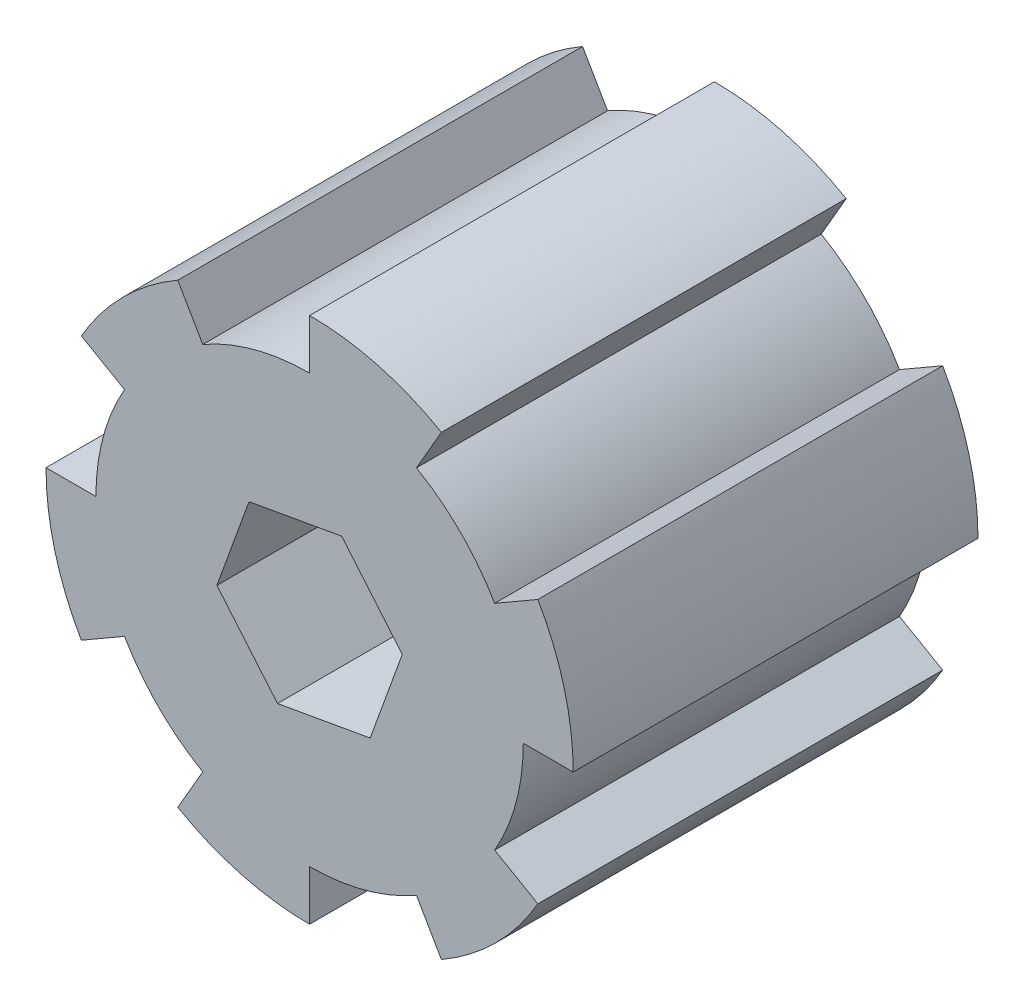
ISO-10303-21;
HEADER;
FILE_DESCRIPTION(('STEP AP214'),'2;1');
FILE_NAME('part.step','',(''),(''),'','','');
FILE_SCHEMA(('AUTOMOTIVE_DESIGN { 1 0 10303 214 1 1 1 1 }'));
ENDSEC;
DATA;
#1=APPLICATION_CONTEXT('core data for automotive mechanical design processes');
#2=APPLICATION_PROTOCOL_DEFINITION('international standard','automotive_design',2000,#1);
#3=PRODUCT_CONTEXT('',#1,'mechanical');
#4=PRODUCT('Part','Part','',(#3));
#5=PRODUCT_RELATED_PRODUCT_CATEGORY('part','',(#4));
#6=PRODUCT_DEFINITION_FORMATION('','',#4);
#7=PRODUCT_DEFINITION_CONTEXT('part definition',#1,'design');
#8=PRODUCT_DEFINITION('design','',#6,#7);
#9=PRODUCT_DEFINITION_SHAPE('','',#8);
#10=(LENGTH_UNIT() NAMED_UNIT(*) SI_UNIT(.MILLI.,.METRE.));
#11=(NAMED_UNIT(*) PLANE_ANGLE_UNIT() SI_UNIT($,.RADIAN.));
#12=(NAMED_UNIT(*) SI_UNIT($,.STERADIAN.) SOLID_ANGLE_UNIT());
#13=UNCERTAINTY_MEASURE_WITH_UNIT(LENGTH_MEASURE(1.E-05),#10,'distance_accuracy_value','');
#14=(GEOMETRIC_REPRESENTATION_CONTEXT(3) GLOBAL_UNCERTAINTY_ASSIGNED_CONTEXT((#13)) GLOBAL_UNIT_ASSIGNED_CONTEXT((#10,
#11,#12)) REPRESENTATION_CONTEXT('',''));
#15=CARTESIAN_POINT('',(0.,0.,0.));
#16=DIRECTION('',(0.,0.,1.));
#17=DIRECTION('',(1.,0.,0.));
#18=AXIS2_PLACEMENT_3D('',#15,#16,#17);
#19=CARTESIAN_POINT('',(0.,0.,21.5));
#20=DIRECTION('',(0.,0.,1.));
#21=DIRECTION('',(1.,0.,0.));
#22=AXIS2_PLACEMENT_3D('',#19,#20,#21);
#23=PLANE('',#22);
#24=CARTESIAN_POINT('',(0.,0.,21.5));
#25=DIRECTION('',(0.,0.,1.));
#26=DIRECTION('',(1.,0.,0.));
#27=AXIS2_PLACEMENT_3D('',#24,#25,#26);
#28=CIRCLE('',#27,11.35);
#29=CARTESIAN_POINT('',(0.,11.35,21.5));
#30=VERTEX_POINT('',#29);
#31=CARTESIAN_POINT('',(-5.67499999999995,9.82938833295341,21.5));
#32=VERTEX_POINT('',#31);
#33=EDGE_CURVE('E281',#30,#32,#28,.T.);
#34=ORIENTED_EDGE('',*,*,#33,.T.);
#35=DIRECTION('',(-0.499999999999995,0.866025403784441,0.));
#36=VECTOR('',#35,1.);
#37=CARTESIAN_POINT('',(-6.99999999999993,12.1243556529822,21.5));
#38=LINE('',#37,#36);
#39=CARTESIAN_POINT('',(-6.99999999999993,12.1243556529822,21.5));
#40=VERTEX_POINT('',#39);
#41=EDGE_CURVE('E284',#32,#40,#38,.T.);
#42=ORIENTED_EDGE('',*,*,#41,.T.);
#43=CARTESIAN_POINT('',(0.,0.,21.5));
#44=DIRECTION('',(0.,0.,1.));
#45=DIRECTION('',(1.,0.,0.));
#46=AXIS2_PLACEMENT_3D('',#43,#44,#45);
#47=CIRCLE('',#46,14.);
#48=CARTESIAN_POINT('',(-12.1243556529821,7.00000000000014,21.5));
#49=VERTEX_POINT('',#48);
#50=EDGE_CURVE('E287',#40,#49,#47,.T.);
#51=ORIENTED_EDGE('',*,*,#50,.T.);
#52=DIRECTION('',(0.866025403784433,-0.500000000000009,0.));
#53=VECTOR('',#52,1.);
#54=CARTESIAN_POINT('',(-9.82938833295331,5.67500000000011,21.5));
#55=LINE('',#54,#53);
#56=CARTESIAN_POINT('',(-9.82938833295331,5.67500000000011,21.5));
#57=VERTEX_POINT('',#56);
#58=EDGE_CURVE('E289',#49,#57,#55,.T.);
#59=ORIENTED_EDGE('',*,*,#58,.T.);
#60=CARTESIAN_POINT('',(0.,0.,21.5));
#61=DIRECTION('',(0.,0.,1.));
#62=DIRECTION('',(1.,0.,0.));
#63=AXIS2_PLACEMENT_3D('',#60,#61,#62);
#64=CIRCLE('',#63,11.35);
#65=CARTESIAN_POINT('',(-11.35,0.,21.5));
#66=VERTEX_POINT('',#65);
#67=EDGE_CURVE('E291',#57,#66,#64,.T.);
#68=ORIENTED_EDGE('',*,*,#67,.T.);
#69=DIRECTION('',(-1.,0.,0.));
#70=VECTOR('',#69,1.);
#71=CARTESIAN_POINT('',(-11.35,0.,21.5));
#72=LINE('',#71,#70);
#73=CARTESIAN_POINT('',(-14.,0.,21.5));
#74=VERTEX_POINT('',#73);
#75=EDGE_CURVE('E293',#66,#74,#72,.T.);
#76=ORIENTED_EDGE('',*,*,#75,.T.);
#77=CARTESIAN_POINT('',(0.,0.,21.5));
#78=DIRECTION('',(0.,0.,1.));
#79=DIRECTION('',(1.,0.,0.));
#80=AXIS2_PLACEMENT_3D('',#77,#78,#79);
#81=CIRCLE('',#80,14.);
#82=CARTESIAN_POINT('',(-12.1243556529821,-7.00000000000015,21.5));
#83=VERTEX_POINT('',#82);
#84=EDGE_CURVE('E295',#74,#83,#81,.T.);
#85=ORIENTED_EDGE('',*,*,#84,.T.);
#86=DIRECTION('',(0.866025403784432,0.500000000000011,0.));
#87=VECTOR('',#86,1.);
#88=CARTESIAN_POINT('',(-9.82938833295331,-5.67500000000012,21.5));
#89=LINE('',#88,#87);
#90=CARTESIAN_POINT('',(-9.82938833295331,-5.67500000000012,21.5));
#91=VERTEX_POINT('',#90);
#92=EDGE_CURVE('E297',#83,#91,#89,.T.);
#93=ORIENTED_EDGE('',*,*,#92,.T.);
#94=CARTESIAN_POINT('',(0.,0.,21.5));
#95=DIRECTION('',(0.,0.,1.));
#96=DIRECTION('',(1.,0.,0.));
#97=AXIS2_PLACEMENT_3D('',#94,#95,#96);
#98=CIRCLE('',#97,11.35);
#99=CARTESIAN_POINT('',(-5.67499999999994,-9.82938833295341,21.5));
#100=VERTEX_POINT('',#99);
#101=EDGE_CURVE('E299',#91,#100,#98,.T.);
#102=ORIENTED_EDGE('',*,*,#101,.T.);
#103=DIRECTION('',(-0.499999999999994,-0.866025403784442,0.));
#104=VECTOR('',#103,1.);
#105=CARTESIAN_POINT('',(-6.99999999999992,-12.1243556529822,21.5));
#106=LINE('',#105,#104);
#107=CARTESIAN_POINT('',(-6.99999999999992,-12.1243556529822,21.5));
#108=VERTEX_POINT('',#107);
#109=EDGE_CURVE('E301',#100,#108,#106,.T.);
#110=ORIENTED_EDGE('',*,*,#109,.T.);
#111=CARTESIAN_POINT('',(0.,0.,21.5));
#112=DIRECTION('',(0.,0.,1.));
#113=DIRECTION('',(1.,0.,0.));
#114=AXIS2_PLACEMENT_3D('',#111,#112,#113);
#115=CIRCLE('',#114,14.);
#116=CARTESIAN_POINT('',(0.,-14.,21.5));
#117=VERTEX_POINT('',#116);
#118=EDGE_CURVE('E303',#108,#117,#115,.T.);
#119=ORIENTED_EDGE('',*,*,#118,.T.);
#120=DIRECTION('',(0.,1.,0.));
#121=VECTOR('',#120,1.);
#122=CARTESIAN_POINT('',(0.,-11.35,21.5));
#123=LINE('',#122,#121);
#124=CARTESIAN_POINT('',(0.,-11.35,21.5));
#125=VERTEX_POINT('',#124);
#126=EDGE_CURVE('E305',#117,#125,#123,.T.);
#127=ORIENTED_EDGE('',*,*,#126,.T.);
#128=CARTESIAN_POINT('',(0.,0.,21.5));
#129=DIRECTION('',(0.,0.,1.));
#130=DIRECTION('',(1.,0.,0.));
#131=AXIS2_PLACEMENT_3D('',#128,#129,#130);
#132=CIRCLE('',#131,11.35);
#133=CARTESIAN_POINT('',(5.67499999999994,-9.82938833295341,21.5));
#134=VERTEX_POINT('',#133);
#135=EDGE_CURVE('E307',#125,#134,#132,.T.);
#136=ORIENTED_EDGE('',*,*,#135,.T.);
#137=DIRECTION('',(0.499999999999996,-0.866025403784441,0.));
#138=VECTOR('',#137,1.);
#139=CARTESIAN_POINT('',(5.67499999999994,-9.82938833295341,21.5));
#140=LINE('',#139,#138);
#141=CARTESIAN_POINT('',(6.99999999999993,-12.1243556529822,21.5));
#142=VERTEX_POINT('',#141);
#143=EDGE_CURVE('E309',#134,#142,#140,.T.);
#144=ORIENTED_EDGE('',*,*,#143,.T.);
#145=CARTESIAN_POINT('',(0.,0.,21.5));
#146=DIRECTION('',(0.,0.,1.));
#147=DIRECTION('',(1.,0.,0.));
#148=AXIS2_PLACEMENT_3D('',#145,#146,#147);
#149=CIRCLE('',#148,14.);
#150=CARTESIAN_POINT('',(12.1243556529821,-7.00000000000015,21.5));
#151=VERTEX_POINT('',#150);
#152=EDGE_CURVE('E311',#142,#151,#149,.T.);
#153=ORIENTED_EDGE('',*,*,#152,.T.);
#154=DIRECTION('',(-0.866025403784433,0.500000000000009,0.));
#155=VECTOR('',#154,1.);
#156=CARTESIAN_POINT('',(12.1243556529821,-7.00000000000014,21.5));
#157=LINE('',#156,#155);
#158=CARTESIAN_POINT('',(9.82938833295331,-5.67500000000011,21.5));
#159=VERTEX_POINT('',#158);
#160=EDGE_CURVE('E313',#151,#159,#157,.T.);
#161=ORIENTED_EDGE('',*,*,#160,.T.);
#162=CARTESIAN_POINT('',(0.,0.,21.5));
#163=DIRECTION('',(0.,0.,1.));
#164=DIRECTION('',(1.,0.,0.));
#165=AXIS2_PLACEMENT_3D('',#162,#163,#164);
#166=CIRCLE('',#165,11.35);
#167=CARTESIAN_POINT('',(11.35,0.,21.5));
#168=VERTEX_POINT('',#167);
#169=EDGE_CURVE('E315',#159,#168,#166,.T.);
#170=ORIENTED_EDGE('',*,*,#169,.T.);
#171=DIRECTION('',(1.,0.,0.));
#172=VECTOR('',#171,1.);
#173=CARTESIAN_POINT('',(14.,0.,21.5));
#174=LINE('',#173,#172);
#175=CARTESIAN_POINT('',(14.,0.,21.5));
#176=VERTEX_POINT('',#175);
#177=EDGE_CURVE('E317',#168,#176,#174,.T.);
#178=ORIENTED_EDGE('',*,*,#177,.T.);
#179=CARTESIAN_POINT('',(0.,0.,21.5));
#180=DIRECTION('',(0.,0.,1.));
#181=DIRECTION('',(1.,0.,0.));
#182=AXIS2_PLACEMENT_3D('',#179,#180,#181);
#183=CIRCLE('',#182,14.);
#184=CARTESIAN_POINT('',(12.1243556529821,7.00000000000014,21.5));
#185=VERTEX_POINT('',#184);
#186=EDGE_CURVE('E319',#176,#185,#183,.T.);
#187=ORIENTED_EDGE('',*,*,#186,.T.);
#188=DIRECTION('',(-0.866025403784432,-0.500000000000011,0.));
#189=VECTOR('',#188,1.);
#190=CARTESIAN_POINT('',(12.1243556529821,7.00000000000015,21.5));
#191=LINE('',#190,#189);
#192=CARTESIAN_POINT('',(9.82938833295331,5.67500000000012,21.5));
#193=VERTEX_POINT('',#192);
#194=EDGE_CURVE('E321',#185,#193,#191,.T.);
#195=ORIENTED_EDGE('',*,*,#194,.T.);
#196=CARTESIAN_POINT('',(0.,0.,21.5));
#197=DIRECTION('',(0.,0.,1.));
#198=DIRECTION('',(1.,0.,0.));
#199=AXIS2_PLACEMENT_3D('',#196,#197,#198);
#200=CIRCLE('',#199,11.35);
#201=CARTESIAN_POINT('',(5.67499999999994,9.82938833295341,21.5));
#202=VERTEX_POINT('',#201);
#203=EDGE_CURVE('E323',#193,#202,#200,.T.);
#204=ORIENTED_EDGE('',*,*,#203,.T.);
#205=DIRECTION('',(0.499999999999994,0.866025403784442,0.));
#206=VECTOR('',#205,1.);
#207=CARTESIAN_POINT('',(5.67499999999994,9.82938833295341,21.5));
#208=LINE('',#207,#206);
#209=CARTESIAN_POINT('',(6.99999999999992,12.1243556529822,21.5));
#210=VERTEX_POINT('',#209);
#211=EDGE_CURVE('E325',#202,#210,#208,.T.);
#212=ORIENTED_EDGE('',*,*,#211,.T.);
#213=CARTESIAN_POINT('',(0.,0.,21.5));
#214=DIRECTION('',(0.,0.,1.));
#215=DIRECTION('',(1.,0.,0.));
#216=AXIS2_PLACEMENT_3D('',#213,#214,#215);
#217=CIRCLE('',#216,14.);
#218=CARTESIAN_POINT('',(0.,14.,21.5));
#219=VERTEX_POINT('',#218);
#220=EDGE_CURVE('E327',#210,#219,#217,.T.);
#221=ORIENTED_EDGE('',*,*,#220,.T.);
#222=DIRECTION('',(0.,-1.,0.));
#223=VECTOR('',#222,1.);
#224=CARTESIAN_POINT('',(0.,14.,21.5));
#225=LINE('',#224,#223);
#226=EDGE_CURVE('E329',#219,#30,#225,.T.);
#227=ORIENTED_EDGE('',*,*,#226,.T.);
#228=EDGE_LOOP('',(#34,#42,#51,#59,#68,#76,#85,#93,#102,#110,#119,#127,#136,#144,#153,#161,#170,
#178,#187,#195,#204,#212,#221,#227));
#229=FACE_BOUND('',#228,.T.);
#230=DIRECTION('',(-0.643704535613658,0.765274114831022,0.));
#231=VECTOR('',#230,1.);
#232=CARTESIAN_POINT('',(4.92299546054572,0.874137114785912,21.5));
#233=LINE('',#232,#231);
#234=CARTESIAN_POINT('',(4.92299546054572,0.874137114785912,21.5));
#235=VERTEX_POINT('',#234);
#236=CARTESIAN_POINT('',(1.70447278247743,4.70050768894102,21.5));
#237=VERTEX_POINT('',#236);
#238=EDGE_CURVE('E238',#235,#237,#233,.T.);
#239=ORIENTED_EDGE('',*,*,#238,.F.);
#240=DIRECTION('',(0.340894556495485,0.940101537788204,0.));
#241=VECTOR('',#240,1.);
#242=CARTESIAN_POINT('',(3.21852267806829,-3.82637057415511,21.5));
#243=LINE('',#242,#241);
#244=CARTESIAN_POINT('',(3.21852267806829,-3.82637057415511,21.5));
#245=VERTEX_POINT('',#244);
#246=EDGE_CURVE('E230',#245,#235,#243,.T.);
#247=ORIENTED_EDGE('',*,*,#246,.F.);
#248=DIRECTION('',(0.984599092109144,0.174827422957182,0.));
#249=VECTOR('',#248,1.);
#250=CARTESIAN_POINT('',(-1.70447278247743,-4.70050768894102,21.5));
#251=LINE('',#250,#249);
#252=CARTESIAN_POINT('',(-1.70447278247743,-4.70050768894102,21.5));
#253=VERTEX_POINT('',#252);
#254=EDGE_CURVE('E259',#253,#245,#251,.T.);
#255=ORIENTED_EDGE('',*,*,#254,.F.);
#256=DIRECTION('',(0.643704535613658,-0.765274114831022,0.));
#257=VECTOR('',#256,1.);
#258=CARTESIAN_POINT('',(-4.92299546054572,-0.874137114785912,21.5));
#259=LINE('',#258,#257);
#260=CARTESIAN_POINT('',(-4.92299546054572,-0.874137114785912,21.5));
#261=VERTEX_POINT('',#260);
#262=EDGE_CURVE('E257',#261,#253,#259,.T.);
#263=ORIENTED_EDGE('',*,*,#262,.F.);
#264=DIRECTION('',(-0.340894556495485,-0.940101537788204,0.));
#265=VECTOR('',#264,1.);
#266=CARTESIAN_POINT('',(-3.21852267806829,3.82637057415511,21.5));
#267=LINE('',#266,#265);
#268=CARTESIAN_POINT('',(-3.21852267806829,3.82637057415511,21.5));
#269=VERTEX_POINT('',#268);
#270=EDGE_CURVE('E253',#269,#261,#267,.T.);
#271=ORIENTED_EDGE('',*,*,#270,.F.);
#272=DIRECTION('',(-0.984599092109144,-0.174827422957182,0.));
#273=VECTOR('',#272,1.);
#274=CARTESIAN_POINT('',(1.70447278247743,4.70050768894102,21.5));
#275=LINE('',#274,#273);
#276=EDGE_CURVE('E251',#237,#269,#275,.T.);
#277=ORIENTED_EDGE('',*,*,#276,.F.);
#278=EDGE_LOOP('',(#239,#247,#255,#263,#271,#277));
#279=FACE_BOUND('',#278,.T.);
#280=ADVANCED_FACE('F33',(#229,#279),#23,.T.);
#281=CARTESIAN_POINT('',(0.,0.,0.));
#282=DIRECTION('',(0.,0.,1.));
#283=DIRECTION('',(1.,0.,0.));
#284=AXIS2_PLACEMENT_3D('',#281,#282,#283);
#285=PLANE('',#284);
#286=CARTESIAN_POINT('',(0.,0.,0.));
#287=DIRECTION('',(0.,0.,1.));
#288=DIRECTION('',(1.,0.,0.));
#289=AXIS2_PLACEMENT_3D('',#286,#287,#288);
#290=CIRCLE('',#289,11.35);
#291=CARTESIAN_POINT('',(0.,11.35,0.));
#292=VERTEX_POINT('',#291);
#293=CARTESIAN_POINT('',(-5.67499999999995,9.82938833295341,0.));
#294=VERTEX_POINT('',#293);
#295=EDGE_CURVE('E246',#292,#294,#290,.T.);
#296=ORIENTED_EDGE('',*,*,#295,.F.);
#297=DIRECTION('',(0.,-1.,0.));
#298=VECTOR('',#297,1.);
#299=CARTESIAN_POINT('',(0.,14.,0.));
#300=LINE('',#299,#298);
#301=CARTESIAN_POINT('',(0.,14.,0.));
#302=VERTEX_POINT('',#301);
#303=EDGE_CURVE('E285',#302,#292,#300,.T.);
#304=ORIENTED_EDGE('',*,*,#303,.F.);
#305=CARTESIAN_POINT('',(0.,0.,0.));
#306=DIRECTION('',(0.,0.,1.));
#307=DIRECTION('',(1.,0.,0.));
#308=AXIS2_PLACEMENT_3D('',#305,#306,#307);
#309=CIRCLE('',#308,14.);
#310=CARTESIAN_POINT('',(6.99999999999992,12.1243556529822,0.));
#311=VERTEX_POINT('',#310);
#312=EDGE_CURVE('E376',#311,#302,#309,.T.);
#313=ORIENTED_EDGE('',*,*,#312,.F.);
#314=DIRECTION('',(0.499999999999994,0.866025403784442,0.));
#315=VECTOR('',#314,1.);
#316=CARTESIAN_POINT('',(5.67499999999994,9.82938833295341,0.));
#317=LINE('',#316,#315);
#318=CARTESIAN_POINT('',(5.67499999999994,9.82938833295341,0.));
#319=VERTEX_POINT('',#318);
#320=EDGE_CURVE('E374',#319,#311,#317,.T.);
#321=ORIENTED_EDGE('',*,*,#320,.F.);
#322=CARTESIAN_POINT('',(0.,0.,0.));
#323=DIRECTION('',(0.,0.,1.));
#324=DIRECTION('',(1.,0.,0.));
#325=AXIS2_PLACEMENT_3D('',#322,#323,#324);
#326=CIRCLE('',#325,11.35);
#327=CARTESIAN_POINT('',(9.82938833295331,5.67500000000012,0.));
#328=VERTEX_POINT('',#327);
#329=EDGE_CURVE('E372',#328,#319,#326,.T.);
#330=ORIENTED_EDGE('',*,*,#329,.F.);
#331=DIRECTION('',(-0.866025403784432,-0.500000000000011,0.));
#332=VECTOR('',#331,1.);
#333=CARTESIAN_POINT('',(12.1243556529821,7.00000000000015,0.));
#334=LINE('',#333,#332);
#335=CARTESIAN_POINT('',(12.1243556529821,7.00000000000014,0.));
#336=VERTEX_POINT('',#335);
#337=EDGE_CURVE('E370',#336,#328,#334,.T.);
#338=ORIENTED_EDGE('',*,*,#337,.F.);
#339=CARTESIAN_POINT('',(0.,0.,0.));
#340=DIRECTION('',(0.,0.,1.));
#341=DIRECTION('',(1.,0.,0.));
#342=AXIS2_PLACEMENT_3D('',#339,#340,#341);
#343=CIRCLE('',#342,14.);
#344=CARTESIAN_POINT('',(14.,0.,0.));
#345=VERTEX_POINT('',#344);
#346=EDGE_CURVE('E368',#345,#336,#343,.T.);
#347=ORIENTED_EDGE('',*,*,#346,.F.);
#348=DIRECTION('',(1.,0.,0.));
#349=VECTOR('',#348,1.);
#350=CARTESIAN_POINT('',(14.,0.,0.));
#351=LINE('',#350,#349);
#352=CARTESIAN_POINT('',(11.35,0.,0.));
#353=VERTEX_POINT('',#352);
#354=EDGE_CURVE('E366',#353,#345,#351,.T.);
#355=ORIENTED_EDGE('',*,*,#354,.F.);
#356=CARTESIAN_POINT('',(0.,0.,0.));
#357=DIRECTION('',(0.,0.,1.));
#358=DIRECTION('',(1.,0.,0.));
#359=AXIS2_PLACEMENT_3D('',#356,#357,#358);
#360=CIRCLE('',#359,11.35);
#361=CARTESIAN_POINT('',(9.82938833295331,-5.67500000000011,0.));
#362=VERTEX_POINT('',#361);
#363=EDGE_CURVE('E364',#362,#353,#360,.T.);
#364=ORIENTED_EDGE('',*,*,#363,.F.);
#365=DIRECTION('',(-0.866025403784433,0.500000000000009,0.));
#366=VECTOR('',#365,1.);
#367=CARTESIAN_POINT('',(12.1243556529821,-7.00000000000014,0.));
#368=LINE('',#367,#366);
#369=CARTESIAN_POINT('',(12.1243556529821,-7.00000000000015,0.));
#370=VERTEX_POINT('',#369);
#371=EDGE_CURVE('E362',#370,#362,#368,.T.);
#372=ORIENTED_EDGE('',*,*,#371,.F.);
#373=CARTESIAN_POINT('',(0.,0.,0.));
#374=DIRECTION('',(0.,0.,1.));
#375=DIRECTION('',(1.,0.,0.));
#376=AXIS2_PLACEMENT_3D('',#373,#374,#375);
#377=CIRCLE('',#376,14.);
#378=CARTESIAN_POINT('',(6.99999999999993,-12.1243556529822,0.));
#379=VERTEX_POINT('',#378);
#380=EDGE_CURVE('E360',#379,#370,#377,.T.);
#381=ORIENTED_EDGE('',*,*,#380,.F.);
#382=DIRECTION('',(0.499999999999996,-0.866025403784441,0.));
#383=VECTOR('',#382,1.);
#384=CARTESIAN_POINT('',(5.67499999999994,-9.82938833295341,0.));
#385=LINE('',#384,#383);
#386=CARTESIAN_POINT('',(5.67499999999994,-9.82938833295341,0.));
#387=VERTEX_POINT('',#386);
#388=EDGE_CURVE('E358',#387,#379,#385,.T.);
#389=ORIENTED_EDGE('',*,*,#388,.F.);
#390=CARTESIAN_POINT('',(0.,0.,0.));
#391=DIRECTION('',(0.,0.,1.));
#392=DIRECTION('',(1.,0.,0.));
#393=AXIS2_PLACEMENT_3D('',#390,#391,#392);
#394=CIRCLE('',#393,11.35);
#395=CARTESIAN_POINT('',(0.,-11.35,0.));
#396=VERTEX_POINT('',#395);
#397=EDGE_CURVE('E356',#396,#387,#394,.T.);
#398=ORIENTED_EDGE('',*,*,#397,.F.);
#399=DIRECTION('',(0.,1.,0.));
#400=VECTOR('',#399,1.);
#401=CARTESIAN_POINT('',(0.,-11.35,0.));
#402=LINE('',#401,#400);
#403=CARTESIAN_POINT('',(0.,-14.,0.));
#404=VERTEX_POINT('',#403);
#405=EDGE_CURVE('E354',#404,#396,#402,.T.);
#406=ORIENTED_EDGE('',*,*,#405,.F.);
#407=CARTESIAN_POINT('',(0.,0.,0.));
#408=DIRECTION('',(0.,0.,1.));
#409=DIRECTION('',(1.,0.,0.));
#410=AXIS2_PLACEMENT_3D('',#407,#408,#409);
#411=CIRCLE('',#410,14.);
#412=CARTESIAN_POINT('',(-6.99999999999992,-12.1243556529822,0.));
#413=VERTEX_POINT('',#412);
#414=EDGE_CURVE('E352',#413,#404,#411,.T.);
#415=ORIENTED_EDGE('',*,*,#414,.F.);
#416=DIRECTION('',(-0.499999999999994,-0.866025403784442,0.));
#417=VECTOR('',#416,1.);
#418=CARTESIAN_POINT('',(-6.99999999999992,-12.1243556529822,0.));
#419=LINE('',#418,#417);
#420=CARTESIAN_POINT('',(-5.67499999999994,-9.82938833295341,0.));
#421=VERTEX_POINT('',#420);
#422=EDGE_CURVE('E350',#421,#413,#419,.T.);
#423=ORIENTED_EDGE('',*,*,#422,.F.);
#424=CARTESIAN_POINT('',(0.,0.,0.));
#425=DIRECTION('',(0.,0.,1.));
#426=DIRECTION('',(1.,0.,0.));
#427=AXIS2_PLACEMENT_3D('',#424,#425,#426);
#428=CIRCLE('',#427,11.35);
#429=CARTESIAN_POINT('',(-9.82938833295331,-5.67500000000012,0.));
#430=VERTEX_POINT('',#429);
#431=EDGE_CURVE('E348',#430,#421,#428,.T.);
#432=ORIENTED_EDGE('',*,*,#431,.F.);
#433=DIRECTION('',(0.866025403784432,0.500000000000011,0.));
#434=VECTOR('',#433,1.);
#435=CARTESIAN_POINT('',(-9.82938833295331,-5.67500000000012,0.));
#436=LINE('',#435,#434);
#437=CARTESIAN_POINT('',(-12.1243556529821,-7.00000000000015,0.));
#438=VERTEX_POINT('',#437);
#439=EDGE_CURVE('E346',#438,#430,#436,.T.);
#440=ORIENTED_EDGE('',*,*,#439,.F.);
#441=CARTESIAN_POINT('',(0.,0.,0.));
#442=DIRECTION('',(0.,0.,1.));
#443=DIRECTION('',(1.,0.,0.));
#444=AXIS2_PLACEMENT_3D('',#441,#442,#443);
#445=CIRCLE('',#444,14.);
#446=CARTESIAN_POINT('',(-14.,0.,0.));
#447=VERTEX_POINT('',#446);
#448=EDGE_CURVE('E344',#447,#438,#445,.T.);
#449=ORIENTED_EDGE('',*,*,#448,.F.);
#450=DIRECTION('',(-1.,0.,0.));
#451=VECTOR('',#450,1.);
#452=CARTESIAN_POINT('',(-11.35,0.,0.));
#453=LINE('',#452,#451);
#454=CARTESIAN_POINT('',(-11.35,0.,0.));
#455=VERTEX_POINT('',#454);
#456=EDGE_CURVE('E342',#455,#447,#453,.T.);
#457=ORIENTED_EDGE('',*,*,#456,.F.);
#458=CARTESIAN_POINT('',(0.,0.,0.));
#459=DIRECTION('',(0.,0.,1.));
#460=DIRECTION('',(1.,0.,0.));
#461=AXIS2_PLACEMENT_3D('',#458,#459,#460);
#462=CIRCLE('',#461,11.35);
#463=CARTESIAN_POINT('',(-9.82938833295331,5.67500000000011,0.));
#464=VERTEX_POINT('',#463);
#465=EDGE_CURVE('E340',#464,#455,#462,.T.);
#466=ORIENTED_EDGE('',*,*,#465,.F.);
#467=DIRECTION('',(0.866025403784433,-0.500000000000009,0.));
#468=VECTOR('',#467,1.);
#469=CARTESIAN_POINT('',(-9.82938833295331,5.67500000000011,0.));
#470=LINE('',#469,#468);
#471=CARTESIAN_POINT('',(-12.1243556529821,7.00000000000014,0.));
#472=VERTEX_POINT('',#471);
#473=EDGE_CURVE('E338',#472,#464,#470,.T.);
#474=ORIENTED_EDGE('',*,*,#473,.F.);
#475=CARTESIAN_POINT('',(0.,0.,0.));
#476=DIRECTION('',(0.,0.,1.));
#477=DIRECTION('',(1.,0.,0.));
#478=AXIS2_PLACEMENT_3D('',#475,#476,#477);
#479=CIRCLE('',#478,14.);
#480=CARTESIAN_POINT('',(-6.99999999999993,12.1243556529822,0.));
#481=VERTEX_POINT('',#480);
#482=EDGE_CURVE('E336',#481,#472,#479,.T.);
#483=ORIENTED_EDGE('',*,*,#482,.F.);
#484=DIRECTION('',(-0.499999999999995,0.866025403784441,0.));
#485=VECTOR('',#484,1.);
#486=CARTESIAN_POINT('',(-6.99999999999993,12.1243556529822,0.));
#487=LINE('',#486,#485);
#488=EDGE_CURVE('E334',#294,#481,#487,.T.);
#489=ORIENTED_EDGE('',*,*,#488,.F.);
#490=EDGE_LOOP('',(#296,#304,#313,#321,#330,#338,#347,#355,#364,#372,#381,#389,#398,#406,#415,
#423,#432,#440,#449,#457,#466,#474,#483,#489));
#491=FACE_BOUND('',#490,.T.);
#492=DIRECTION('',(0.340894556495485,0.940101537788204,0.));
#493=VECTOR('',#492,1.);
#494=CARTESIAN_POINT('',(3.21852267806829,-3.82637057415511,0.));
#495=LINE('',#494,#493);
#496=CARTESIAN_POINT('',(3.21852267806829,-3.82637057415511,0.));
#497=VERTEX_POINT('',#496);
#498=CARTESIAN_POINT('',(4.92299546054572,0.874137114785912,0.));
#499=VERTEX_POINT('',#498);
#500=EDGE_CURVE('E56',#497,#499,#495,.T.);
#501=ORIENTED_EDGE('',*,*,#500,.T.);
#502=DIRECTION('',(-0.643704535613658,0.765274114831022,0.));
#503=VECTOR('',#502,1.);
#504=CARTESIAN_POINT('',(4.92299546054572,0.874137114785912,0.));
#505=LINE('',#504,#503);
#506=CARTESIAN_POINT('',(1.70447278247743,4.70050768894102,0.));
#507=VERTEX_POINT('',#506);
#508=EDGE_CURVE('E245',#499,#507,#505,.T.);
#509=ORIENTED_EDGE('',*,*,#508,.T.);
#510=DIRECTION('',(-0.984599092109144,-0.174827422957182,0.));
#511=VECTOR('',#510,1.);
#512=CARTESIAN_POINT('',(1.70447278247743,4.70050768894102,0.));
#513=LINE('',#512,#511);
#514=CARTESIAN_POINT('',(-3.21852267806829,3.82637057415511,0.));
#515=VERTEX_POINT('',#514);
#516=EDGE_CURVE('E263',#507,#515,#513,.T.);
#517=ORIENTED_EDGE('',*,*,#516,.T.);
#518=DIRECTION('',(-0.340894556495485,-0.940101537788204,0.));
#519=VECTOR('',#518,1.);
#520=CARTESIAN_POINT('',(-3.21852267806829,3.82637057415511,0.));
#521=LINE('',#520,#519);
#522=CARTESIAN_POINT('',(-4.92299546054572,-0.874137114785912,0.));
#523=VERTEX_POINT('',#522);
#524=EDGE_CURVE('E266',#515,#523,#521,.T.);
#525=ORIENTED_EDGE('',*,*,#524,.T.);
#526=DIRECTION('',(0.643704535613658,-0.765274114831022,0.));
#527=VECTOR('',#526,1.);
#528=CARTESIAN_POINT('',(-4.92299546054572,-0.874137114785912,0.));
#529=LINE('',#528,#527);
#530=CARTESIAN_POINT('',(-1.70447278247743,-4.70050768894102,0.));
#531=VERTEX_POINT('',#530);
#532=EDGE_CURVE('E269',#523,#531,#529,.T.);
#533=ORIENTED_EDGE('',*,*,#532,.T.);
#534=DIRECTION('',(0.984599092109144,0.174827422957182,0.));
#535=VECTOR('',#534,1.);
#536=CARTESIAN_POINT('',(-1.70447278247743,-4.70050768894102,0.));
#537=LINE('',#536,#535);
#538=EDGE_CURVE('E239',#531,#497,#537,.T.);
#539=ORIENTED_EDGE('',*,*,#538,.T.);
#540=EDGE_LOOP('',(#501,#509,#517,#525,#533,#539));
#541=FACE_BOUND('',#540,.T.);
#542=ADVANCED_FACE('F454',(#491,#541),#285,.F.);
#543=CARTESIAN_POINT('',(0.,0.,21.5));
#544=DIRECTION('',(0.,0.,-1.));
#545=DIRECTION('',(-1.,0.,0.));
#546=AXIS2_PLACEMENT_3D('',#543,#544,#545);
#547=CYLINDRICAL_SURFACE('',#546,11.35);
#548=ORIENTED_EDGE('',*,*,#295,.T.);
#549=DIRECTION('',(0.,0.,-1.));
#550=VECTOR('',#549,1.);
#551=CARTESIAN_POINT('',(-5.67499999999995,9.82938833295341,21.5));
#552=LINE('',#551,#550);
#553=EDGE_CURVE('E11',#32,#294,#552,.T.);
#554=ORIENTED_EDGE('',*,*,#553,.F.);
#555=ORIENTED_EDGE('',*,*,#33,.F.);
#556=DIRECTION('',(0.,0.,-1.));
#557=VECTOR('',#556,1.);
#558=CARTESIAN_POINT('',(0.,11.35,21.5));
#559=LINE('',#558,#557);
#560=EDGE_CURVE('E331',#30,#292,#559,.T.);
#561=ORIENTED_EDGE('',*,*,#560,.T.);
#562=EDGE_LOOP('',(#548,#554,#555,#561));
#563=FACE_BOUND('',#562,.T.);
#564=ADVANCED_FACE('F35',(#563),#547,.T.);
#565=CARTESIAN_POINT('',(-6.99999999999993,12.1243556529822,21.5));
#566=DIRECTION('',(-0.866025403784441,-0.499999999999995,0.));
#567=DIRECTION('',(0.499999999999995,-0.866025403784441,0.));
#568=AXIS2_PLACEMENT_3D('',#565,#566,#567);
#569=PLANE('',#568);
#570=ORIENTED_EDGE('',*,*,#488,.T.);
#571=DIRECTION('',(0.,0.,-1.));
#572=VECTOR('',#571,1.);
#573=CARTESIAN_POINT('',(-6.99999999999993,12.1243556529822,21.5));
#574=LINE('',#573,#572);
#575=EDGE_CURVE('E41',#40,#481,#574,.T.);
#576=ORIENTED_EDGE('',*,*,#575,.F.);
#577=ORIENTED_EDGE('',*,*,#41,.F.);
#578=ORIENTED_EDGE('',*,*,#553,.T.);
#579=EDGE_LOOP('',(#570,#576,#577,#578));
#580=FACE_BOUND('',#579,.T.);
#581=ADVANCED_FACE('F471',(#580),#569,.F.);
#582=CARTESIAN_POINT('',(0.,0.,21.5));
#583=DIRECTION('',(0.,0.,-1.));
#584=DIRECTION('',(-1.,0.,0.));
#585=AXIS2_PLACEMENT_3D('',#582,#583,#584);
#586=CYLINDRICAL_SURFACE('',#585,14.);
#587=ORIENTED_EDGE('',*,*,#482,.T.);
#588=DIRECTION('',(0.,0.,-1.));
#589=VECTOR('',#588,1.);
#590=CARTESIAN_POINT('',(-12.1243556529821,7.00000000000014,21.5));
#591=LINE('',#590,#589);
#592=EDGE_CURVE('E441',#49,#472,#591,.T.);
#593=ORIENTED_EDGE('',*,*,#592,.F.);
#594=ORIENTED_EDGE('',*,*,#50,.F.);
#595=ORIENTED_EDGE('',*,*,#575,.T.);
#596=EDGE_LOOP('',(#587,#593,#594,#595));
#597=FACE_BOUND('',#596,.T.);
#598=ADVANCED_FACE('F448',(#597),#586,.T.);
#599=CARTESIAN_POINT('',(-9.82938833295331,5.67500000000011,21.5));
#600=DIRECTION('',(0.500000000000009,0.866025403784433,0.));
#601=DIRECTION('',(-0.866025403784433,0.500000000000009,0.));
#602=AXIS2_PLACEMENT_3D('',#599,#600,#601);
#603=PLANE('',#602);
#604=ORIENTED_EDGE('',*,*,#473,.T.);
#605=DIRECTION('',(0.,0.,-1.));
#606=VECTOR('',#605,1.);
#607=CARTESIAN_POINT('',(-9.82938833295331,5.67500000000011,21.5));
#608=LINE('',#607,#606);
#609=EDGE_CURVE('E438',#57,#464,#608,.T.);
#610=ORIENTED_EDGE('',*,*,#609,.F.);
#611=ORIENTED_EDGE('',*,*,#58,.F.);
#612=ORIENTED_EDGE('',*,*,#592,.T.);
#613=EDGE_LOOP('',(#604,#610,#611,#612));
#614=FACE_BOUND('',#613,.T.);
#615=ADVANCED_FACE('F460',(#614),#603,.F.);
#616=CARTESIAN_POINT('',(0.,0.,21.5));
#617=DIRECTION('',(0.,0.,-1.));
#618=DIRECTION('',(-1.,0.,0.));
#619=AXIS2_PLACEMENT_3D('',#616,#617,#618);
#620=CYLINDRICAL_SURFACE('',#619,11.35);
#621=ORIENTED_EDGE('',*,*,#465,.T.);
#622=DIRECTION('',(0.,0.,-1.));
#623=VECTOR('',#622,1.);
#624=CARTESIAN_POINT('',(-11.35,0.,21.5));
#625=LINE('',#624,#623);
#626=EDGE_CURVE('E435',#66,#455,#625,.T.);
#627=ORIENTED_EDGE('',*,*,#626,.F.);
#628=ORIENTED_EDGE('',*,*,#67,.F.);
#629=ORIENTED_EDGE('',*,*,#609,.T.);
#630=EDGE_LOOP('',(#621,#627,#628,#629));
#631=FACE_BOUND('',#630,.T.);
#632=ADVANCED_FACE('F464',(#631),#620,.T.);
#633=CARTESIAN_POINT('',(-11.35,0.,21.5));
#634=DIRECTION('',(0.,-1.,0.));
#635=DIRECTION('',(1.,0.,0.));
#636=AXIS2_PLACEMENT_3D('',#633,#634,#635);
#637=PLANE('',#636);
#638=ORIENTED_EDGE('',*,*,#456,.T.);
#639=DIRECTION('',(0.,0.,-1.));
#640=VECTOR('',#639,1.);
#641=CARTESIAN_POINT('',(-14.,0.,21.5));
#642=LINE('',#641,#640);
#643=EDGE_CURVE('E432',#74,#447,#642,.T.);
#644=ORIENTED_EDGE('',*,*,#643,.F.);
#645=ORIENTED_EDGE('',*,*,#75,.F.);
#646=ORIENTED_EDGE('',*,*,#626,.T.);
#647=EDGE_LOOP('',(#638,#644,#645,#646));
#648=FACE_BOUND('',#647,.T.);
#649=ADVANCED_FACE('F564',(#648),#637,.F.);
#650=CARTESIAN_POINT('',(0.,0.,21.5));
#651=DIRECTION('',(0.,0.,-1.));
#652=DIRECTION('',(-1.,0.,0.));
#653=AXIS2_PLACEMENT_3D('',#650,#651,#652);
#654=CYLINDRICAL_SURFACE('',#653,14.);
#655=ORIENTED_EDGE('',*,*,#448,.T.);
#656=DIRECTION('',(0.,0.,-1.));
#657=VECTOR('',#656,1.);
#658=CARTESIAN_POINT('',(-12.1243556529821,-7.00000000000015,21.5));
#659=LINE('',#658,#657);
#660=EDGE_CURVE('E429',#83,#438,#659,.T.);
#661=ORIENTED_EDGE('',*,*,#660,.F.);
#662=ORIENTED_EDGE('',*,*,#84,.F.);
#663=ORIENTED_EDGE('',*,*,#643,.T.);
#664=EDGE_LOOP('',(#655,#661,#662,#663));
#665=FACE_BOUND('',#664,.T.);
#666=ADVANCED_FACE('F562',(#665),#654,.T.);
#667=CARTESIAN_POINT('',(-9.82938833295331,-5.67500000000012,21.5));
#668=DIRECTION('',(-0.500000000000011,0.866025403784432,0.));
#669=DIRECTION('',(-0.866025403784432,-0.500000000000011,0.));
#670=AXIS2_PLACEMENT_3D('',#667,#668,#669);
#671=PLANE('',#670);
#672=ORIENTED_EDGE('',*,*,#439,.T.);
#673=DIRECTION('',(0.,0.,-1.));
#674=VECTOR('',#673,1.);
#675=CARTESIAN_POINT('',(-9.82938833295331,-5.67500000000012,21.5));
#676=LINE('',#675,#674);
#677=EDGE_CURVE('E426',#91,#430,#676,.T.);
#678=ORIENTED_EDGE('',*,*,#677,.F.);
#679=ORIENTED_EDGE('',*,*,#92,.F.);
#680=ORIENTED_EDGE('',*,*,#660,.T.);
#681=EDGE_LOOP('',(#672,#678,#679,#680));
#682=FACE_BOUND('',#681,.T.);
#683=ADVANCED_FACE('F558',(#682),#671,.F.);
#684=CARTESIAN_POINT('',(0.,0.,21.5));
#685=DIRECTION('',(0.,0.,-1.));
#686=DIRECTION('',(-1.,0.,0.));
#687=AXIS2_PLACEMENT_3D('',#684,#685,#686);
#688=CYLINDRICAL_SURFACE('',#687,11.35);
#689=ORIENTED_EDGE('',*,*,#431,.T.);
#690=DIRECTION('',(0.,0.,-1.));
#691=VECTOR('',#690,1.);
#692=CARTESIAN_POINT('',(-5.67499999999994,-9.82938833295341,21.5));
#693=LINE('',#692,#691);
#694=EDGE_CURVE('E423',#100,#421,#693,.T.);
#695=ORIENTED_EDGE('',*,*,#694,.F.);
#696=ORIENTED_EDGE('',*,*,#101,.F.);
#697=ORIENTED_EDGE('',*,*,#677,.T.);
#698=EDGE_LOOP('',(#689,#695,#696,#697));
#699=FACE_BOUND('',#698,.T.);
#700=ADVANCED_FACE('F553',(#699),#688,.T.);
#701=CARTESIAN_POINT('',(-6.99999999999992,-12.1243556529822,21.5));
#702=DIRECTION('',(0.866025403784442,-0.499999999999994,0.));
#703=DIRECTION('',(0.499999999999994,0.866025403784442,0.));
#704=AXIS2_PLACEMENT_3D('',#701,#702,#703);
#705=PLANE('',#704);
#706=ORIENTED_EDGE('',*,*,#422,.T.);
#707=DIRECTION('',(0.,0.,-1.));
#708=VECTOR('',#707,1.);
#709=CARTESIAN_POINT('',(-6.99999999999992,-12.1243556529822,21.5));
#710=LINE('',#709,#708);
#711=EDGE_CURVE('E420',#108,#413,#710,.T.);
#712=ORIENTED_EDGE('',*,*,#711,.F.);
#713=ORIENTED_EDGE('',*,*,#109,.F.);
#714=ORIENTED_EDGE('',*,*,#694,.T.);
#715=EDGE_LOOP('',(#706,#712,#713,#714));
#716=FACE_BOUND('',#715,.T.);
#717=ADVANCED_FACE('F547',(#716),#705,.F.);
#718=CARTESIAN_POINT('',(0.,0.,21.5));
#719=DIRECTION('',(0.,0.,-1.));
#720=DIRECTION('',(-1.,0.,0.));
#721=AXIS2_PLACEMENT_3D('',#718,#719,#720);
#722=CYLINDRICAL_SURFACE('',#721,14.);
#723=ORIENTED_EDGE('',*,*,#414,.T.);
#724=DIRECTION('',(0.,0.,-1.));
#725=VECTOR('',#724,1.);
#726=CARTESIAN_POINT('',(0.,-14.,21.5));
#727=LINE('',#726,#725);
#728=EDGE_CURVE('E417',#117,#404,#727,.T.);
#729=ORIENTED_EDGE('',*,*,#728,.F.);
#730=ORIENTED_EDGE('',*,*,#118,.F.);
#731=ORIENTED_EDGE('',*,*,#711,.T.);
#732=EDGE_LOOP('',(#723,#729,#730,#731));
#733=FACE_BOUND('',#732,.T.);
#734=ADVANCED_FACE('F543',(#733),#722,.T.);
#735=CARTESIAN_POINT('',(0.,-11.35,21.5));
#736=DIRECTION('',(-1.,0.,0.));
#737=DIRECTION('',(0.,-1.,0.));
#738=AXIS2_PLACEMENT_3D('',#735,#736,#737);
#739=PLANE('',#738);
#740=ORIENTED_EDGE('',*,*,#405,.T.);
#741=DIRECTION('',(0.,0.,-1.));
#742=VECTOR('',#741,1.);
#743=CARTESIAN_POINT('',(0.,-11.35,21.5));
#744=LINE('',#743,#742);
#745=EDGE_CURVE('E414',#125,#396,#744,.T.);
#746=ORIENTED_EDGE('',*,*,#745,.F.);
#747=ORIENTED_EDGE('',*,*,#126,.F.);
#748=ORIENTED_EDGE('',*,*,#728,.T.);
#749=EDGE_LOOP('',(#740,#746,#747,#748));
#750=FACE_BOUND('',#749,.T.);
#751=ADVANCED_FACE('F538',(#750),#739,.F.);
#752=CARTESIAN_POINT('',(0.,0.,21.5));
#753=DIRECTION('',(0.,0.,-1.));
#754=DIRECTION('',(-1.,0.,0.));
#755=AXIS2_PLACEMENT_3D('',#752,#753,#754);
#756=CYLINDRICAL_SURFACE('',#755,11.35);
#757=ORIENTED_EDGE('',*,*,#397,.T.);
#758=DIRECTION('',(0.,0.,-1.));
#759=VECTOR('',#758,1.);
#760=CARTESIAN_POINT('',(5.67499999999994,-9.82938833295341,21.5));
#761=LINE('',#760,#759);
#762=EDGE_CURVE('E411',#134,#387,#761,.T.);
#763=ORIENTED_EDGE('',*,*,#762,.F.);
#764=ORIENTED_EDGE('',*,*,#135,.F.);
#765=ORIENTED_EDGE('',*,*,#745,.T.);
#766=EDGE_LOOP('',(#757,#763,#764,#765));
#767=FACE_BOUND('',#766,.T.);
#768=ADVANCED_FACE('F532',(#767),#756,.T.);
#769=CARTESIAN_POINT('',(5.67499999999994,-9.82938833295341,21.5));
#770=DIRECTION('',(0.866025403784441,0.499999999999996,0.));
#771=DIRECTION('',(-0.499999999999996,0.866025403784441,0.));
#772=AXIS2_PLACEMENT_3D('',#769,#770,#771);
#773=PLANE('',#772);
#774=ORIENTED_EDGE('',*,*,#388,.T.);
#775=DIRECTION('',(0.,0.,-1.));
#776=VECTOR('',#775,1.);
#777=CARTESIAN_POINT('',(6.99999999999993,-12.1243556529822,21.5));
#778=LINE('',#777,#776);
#779=EDGE_CURVE('E408',#142,#379,#778,.T.);
#780=ORIENTED_EDGE('',*,*,#779,.F.);
#781=ORIENTED_EDGE('',*,*,#143,.F.);
#782=ORIENTED_EDGE('',*,*,#762,.T.);
#783=EDGE_LOOP('',(#774,#780,#781,#782));
#784=FACE_BOUND('',#783,.T.);
#785=ADVANCED_FACE('F528',(#784),#773,.F.);
#786=CARTESIAN_POINT('',(0.,0.,21.5));
#787=DIRECTION('',(0.,0.,-1.));
#788=DIRECTION('',(-1.,0.,0.));
#789=AXIS2_PLACEMENT_3D('',#786,#787,#788);
#790=CYLINDRICAL_SURFACE('',#789,14.);
#791=ORIENTED_EDGE('',*,*,#380,.T.);
#792=DIRECTION('',(0.,0.,-1.));
#793=VECTOR('',#792,1.);
#794=CARTESIAN_POINT('',(12.1243556529821,-7.00000000000015,21.5));
#795=LINE('',#794,#793);
#796=EDGE_CURVE('E405',#151,#370,#795,.T.);
#797=ORIENTED_EDGE('',*,*,#796,.F.);
#798=ORIENTED_EDGE('',*,*,#152,.F.);
#799=ORIENTED_EDGE('',*,*,#779,.T.);
#800=EDGE_LOOP('',(#791,#797,#798,#799));
#801=FACE_BOUND('',#800,.T.);
#802=ADVANCED_FACE('F523',(#801),#790,.T.);
#803=CARTESIAN_POINT('',(12.1243556529821,-7.00000000000014,21.5));
#804=DIRECTION('',(-0.500000000000009,-0.866025403784433,0.));
#805=DIRECTION('',(0.866025403784433,-0.500000000000009,0.));
#806=AXIS2_PLACEMENT_3D('',#803,#804,#805);
#807=PLANE('',#806);
#808=ORIENTED_EDGE('',*,*,#371,.T.);
#809=DIRECTION('',(0.,0.,-1.));
#810=VECTOR('',#809,1.);
#811=CARTESIAN_POINT('',(9.82938833295331,-5.67500000000011,21.5));
#812=LINE('',#811,#810);
#813=EDGE_CURVE('E402',#159,#362,#812,.T.);
#814=ORIENTED_EDGE('',*,*,#813,.F.);
#815=ORIENTED_EDGE('',*,*,#160,.F.);
#816=ORIENTED_EDGE('',*,*,#796,.T.);
#817=EDGE_LOOP('',(#808,#814,#815,#816));
#818=FACE_BOUND('',#817,.T.);
#819=ADVANCED_FACE('F517',(#818),#807,.F.);
#820=CARTESIAN_POINT('',(0.,0.,21.5));
#821=DIRECTION('',(0.,0.,-1.));
#822=DIRECTION('',(-1.,0.,0.));
#823=AXIS2_PLACEMENT_3D('',#820,#821,#822);
#824=CYLINDRICAL_SURFACE('',#823,11.35);
#825=ORIENTED_EDGE('',*,*,#363,.T.);
#826=DIRECTION('',(0.,0.,-1.));
#827=VECTOR('',#826,1.);
#828=CARTESIAN_POINT('',(11.35,0.,21.5));
#829=LINE('',#828,#827);
#830=EDGE_CURVE('E399',#168,#353,#829,.T.);
#831=ORIENTED_EDGE('',*,*,#830,.F.);
#832=ORIENTED_EDGE('',*,*,#169,.F.);
#833=ORIENTED_EDGE('',*,*,#813,.T.);
#834=EDGE_LOOP('',(#825,#831,#832,#833));
#835=FACE_BOUND('',#834,.T.);
#836=ADVANCED_FACE('F513',(#835),#824,.T.);
#837=CARTESIAN_POINT('',(14.,0.,21.5));
#838=DIRECTION('',(0.,1.,0.));
#839=DIRECTION('',(-1.,0.,0.));
#840=AXIS2_PLACEMENT_3D('',#837,#838,#839);
#841=PLANE('',#840);
#842=ORIENTED_EDGE('',*,*,#354,.T.);
#843=DIRECTION('',(0.,0.,-1.));
#844=VECTOR('',#843,1.);
#845=CARTESIAN_POINT('',(14.,0.,21.5));
#846=LINE('',#845,#844);
#847=EDGE_CURVE('E396',#176,#345,#846,.T.);
#848=ORIENTED_EDGE('',*,*,#847,.F.);
#849=ORIENTED_EDGE('',*,*,#177,.F.);
#850=ORIENTED_EDGE('',*,*,#830,.T.);
#851=EDGE_LOOP('',(#842,#848,#849,#850));
#852=FACE_BOUND('',#851,.T.);
#853=ADVANCED_FACE('F508',(#852),#841,.F.);
#854=CARTESIAN_POINT('',(0.,0.,21.5));
#855=DIRECTION('',(0.,0.,-1.));
#856=DIRECTION('',(-1.,0.,0.));
#857=AXIS2_PLACEMENT_3D('',#854,#855,#856);
#858=CYLINDRICAL_SURFACE('',#857,14.);
#859=ORIENTED_EDGE('',*,*,#346,.T.);
#860=DIRECTION('',(0.,0.,-1.));
#861=VECTOR('',#860,1.);
#862=CARTESIAN_POINT('',(12.1243556529821,7.00000000000014,21.5));
#863=LINE('',#862,#861);
#864=EDGE_CURVE('E393',#185,#336,#863,.T.);
#865=ORIENTED_EDGE('',*,*,#864,.F.);
#866=ORIENTED_EDGE('',*,*,#186,.F.);
#867=ORIENTED_EDGE('',*,*,#847,.T.);
#868=EDGE_LOOP('',(#859,#865,#866,#867));
#869=FACE_BOUND('',#868,.T.);
#870=ADVANCED_FACE('F502',(#869),#858,.T.);
#871=CARTESIAN_POINT('',(12.1243556529821,7.00000000000015,21.5));
#872=DIRECTION('',(0.500000000000011,-0.866025403784432,0.));
#873=DIRECTION('',(0.866025403784432,0.500000000000011,0.));
#874=AXIS2_PLACEMENT_3D('',#871,#872,#873);
#875=PLANE('',#874);
#876=ORIENTED_EDGE('',*,*,#337,.T.);
#877=DIRECTION('',(0.,0.,-1.));
#878=VECTOR('',#877,1.);
#879=CARTESIAN_POINT('',(9.82938833295331,5.67500000000012,21.5));
#880=LINE('',#879,#878);
#881=EDGE_CURVE('E390',#193,#328,#880,.T.);
#882=ORIENTED_EDGE('',*,*,#881,.F.);
#883=ORIENTED_EDGE('',*,*,#194,.F.);
#884=ORIENTED_EDGE('',*,*,#864,.T.);
#885=EDGE_LOOP('',(#876,#882,#883,#884));
#886=FACE_BOUND('',#885,.T.);
#887=ADVANCED_FACE('F498',(#886),#875,.F.);
#888=CARTESIAN_POINT('',(0.,0.,21.5));
#889=DIRECTION('',(0.,0.,-1.));
#890=DIRECTION('',(-1.,0.,0.));
#891=AXIS2_PLACEMENT_3D('',#888,#889,#890);
#892=CYLINDRICAL_SURFACE('',#891,11.35);
#893=ORIENTED_EDGE('',*,*,#329,.T.);
#894=DIRECTION('',(0.,0.,-1.));
#895=VECTOR('',#894,1.);
#896=CARTESIAN_POINT('',(5.67499999999994,9.82938833295341,21.5));
#897=LINE('',#896,#895);
#898=EDGE_CURVE('E387',#202,#319,#897,.T.);
#899=ORIENTED_EDGE('',*,*,#898,.F.);
#900=ORIENTED_EDGE('',*,*,#203,.F.);
#901=ORIENTED_EDGE('',*,*,#881,.T.);
#902=EDGE_LOOP('',(#893,#899,#900,#901));
#903=FACE_BOUND('',#902,.T.);
#904=ADVANCED_FACE('F493',(#903),#892,.T.);
#905=CARTESIAN_POINT('',(5.67499999999994,9.82938833295341,21.5));
#906=DIRECTION('',(-0.866025403784442,0.499999999999994,0.));
#907=DIRECTION('',(-0.499999999999994,-0.866025403784442,0.));
#908=AXIS2_PLACEMENT_3D('',#905,#906,#907);
#909=PLANE('',#908);
#910=ORIENTED_EDGE('',*,*,#320,.T.);
#911=DIRECTION('',(0.,0.,-1.));
#912=VECTOR('',#911,1.);
#913=CARTESIAN_POINT('',(6.99999999999992,12.1243556529822,21.5));
#914=LINE('',#913,#912);
#915=EDGE_CURVE('E384',#210,#311,#914,.T.);
#916=ORIENTED_EDGE('',*,*,#915,.F.);
#917=ORIENTED_EDGE('',*,*,#211,.F.);
#918=ORIENTED_EDGE('',*,*,#898,.T.);
#919=EDGE_LOOP('',(#910,#916,#917,#918));
#920=FACE_BOUND('',#919,.T.);
#921=ADVANCED_FACE('F487',(#920),#909,.F.);
#922=CARTESIAN_POINT('',(0.,0.,21.5));
#923=DIRECTION('',(0.,0.,-1.));
#924=DIRECTION('',(-1.,0.,0.));
#925=AXIS2_PLACEMENT_3D('',#922,#923,#924);
#926=CYLINDRICAL_SURFACE('',#925,14.);
#927=ORIENTED_EDGE('',*,*,#312,.T.);
#928=DIRECTION('',(0.,0.,-1.));
#929=VECTOR('',#928,1.);
#930=CARTESIAN_POINT('',(0.,14.,21.5));
#931=LINE('',#930,#929);
#932=EDGE_CURVE('E381',#219,#302,#931,.T.);
#933=ORIENTED_EDGE('',*,*,#932,.F.);
#934=ORIENTED_EDGE('',*,*,#220,.F.);
#935=ORIENTED_EDGE('',*,*,#915,.T.);
#936=EDGE_LOOP('',(#927,#933,#934,#935));
#937=FACE_BOUND('',#936,.T.);
#938=ADVANCED_FACE('F483',(#937),#926,.T.);
#939=CARTESIAN_POINT('',(0.,14.,21.5));
#940=DIRECTION('',(1.,0.,0.));
#941=DIRECTION('',(0.,1.,0.));
#942=AXIS2_PLACEMENT_3D('',#939,#940,#941);
#943=PLANE('',#942);
#944=ORIENTED_EDGE('',*,*,#303,.T.);
#945=ORIENTED_EDGE('',*,*,#560,.F.);
#946=ORIENTED_EDGE('',*,*,#226,.F.);
#947=ORIENTED_EDGE('',*,*,#932,.T.);
#948=EDGE_LOOP('',(#944,#945,#946,#947));
#949=FACE_BOUND('',#948,.T.);
#950=ADVANCED_FACE('F478',(#949),#943,.F.);
#951=CARTESIAN_POINT('',(3.21852267806829,-3.82637057415511,21.5));
#952=DIRECTION('',(-0.940101537788204,0.340894556495485,0.));
#953=DIRECTION('',(-0.340894556495485,-0.940101537788204,0.));
#954=AXIS2_PLACEMENT_3D('',#951,#952,#953);
#955=PLANE('',#954);
#956=ORIENTED_EDGE('',*,*,#500,.F.);
#957=DIRECTION('',(0.,0.,-1.));
#958=VECTOR('',#957,1.);
#959=CARTESIAN_POINT('',(3.21852267806829,-3.82637057415511,21.5));
#960=LINE('',#959,#958);
#961=EDGE_CURVE('E234',#245,#497,#960,.T.);
#962=ORIENTED_EDGE('',*,*,#961,.F.);
#963=ORIENTED_EDGE('',*,*,#246,.T.);
#964=DIRECTION('',(0.,0.,-1.));
#965=VECTOR('',#964,1.);
#966=CARTESIAN_POINT('',(4.92299546054572,0.874137114785912,21.5));
#967=LINE('',#966,#965);
#968=EDGE_CURVE('E233',#235,#499,#967,.T.);
#969=ORIENTED_EDGE('',*,*,#968,.T.);
#970=EDGE_LOOP('',(#956,#962,#963,#969));
#971=FACE_BOUND('',#970,.T.);
#972=ADVANCED_FACE('F232',(#971),#955,.T.);
#973=CARTESIAN_POINT('',(4.92299546054572,0.874137114785912,21.5));
#974=DIRECTION('',(-0.765274114831022,-0.643704535613658,0.));
#975=DIRECTION('',(0.643704535613658,-0.765274114831022,0.));
#976=AXIS2_PLACEMENT_3D('',#973,#974,#975);
#977=PLANE('',#976);
#978=ORIENTED_EDGE('',*,*,#508,.F.);
#979=ORIENTED_EDGE('',*,*,#968,.F.);
#980=ORIENTED_EDGE('',*,*,#238,.T.);
#981=DIRECTION('',(0.,0.,-1.));
#982=VECTOR('',#981,1.);
#983=CARTESIAN_POINT('',(1.70447278247743,4.70050768894102,21.5));
#984=LINE('',#983,#982);
#985=EDGE_CURVE('E247',#237,#507,#984,.T.);
#986=ORIENTED_EDGE('',*,*,#985,.T.);
#987=EDGE_LOOP('',(#978,#979,#980,#986));
#988=FACE_BOUND('',#987,.T.);
#989=ADVANCED_FACE('F242',(#988),#977,.T.);
#990=CARTESIAN_POINT('',(1.70447278247743,4.70050768894102,21.5));
#991=DIRECTION('',(0.174827422957182,-0.984599092109144,0.));
#992=DIRECTION('',(0.984599092109144,0.174827422957182,0.));
#993=AXIS2_PLACEMENT_3D('',#990,#991,#992);
#994=PLANE('',#993);
#995=ORIENTED_EDGE('',*,*,#516,.F.);
#996=ORIENTED_EDGE('',*,*,#985,.F.);
#997=ORIENTED_EDGE('',*,*,#276,.T.);
#998=DIRECTION('',(0.,0.,-1.));
#999=VECTOR('',#998,1.);
#1000=CARTESIAN_POINT('',(-3.21852267806829,3.82637057415511,21.5));
#1001=LINE('',#1000,#999);
#1002=EDGE_CURVE('E278',#269,#515,#1001,.T.);
#1003=ORIENTED_EDGE('',*,*,#1002,.T.);
#1004=EDGE_LOOP('',(#995,#996,#997,#1003));
#1005=FACE_BOUND('',#1004,.T.);
#1006=ADVANCED_FACE('F694',(#1005),#994,.T.);
#1007=CARTESIAN_POINT('',(-3.21852267806829,3.82637057415511,21.5));
#1008=DIRECTION('',(0.940101537788204,-0.340894556495485,0.));
#1009=DIRECTION('',(0.340894556495485,0.940101537788204,0.));
#1010=AXIS2_PLACEMENT_3D('',#1007,#1008,#1009);
#1011=PLANE('',#1010);
#1012=ORIENTED_EDGE('',*,*,#524,.F.);
#1013=ORIENTED_EDGE('',*,*,#1002,.F.);
#1014=ORIENTED_EDGE('',*,*,#270,.T.);
#1015=DIRECTION('',(0.,0.,-1.));
#1016=VECTOR('',#1015,1.);
#1017=CARTESIAN_POINT('',(-4.92299546054572,-0.874137114785912,21.5));
#1018=LINE('',#1017,#1016);
#1019=EDGE_CURVE('E276',#261,#523,#1018,.T.);
#1020=ORIENTED_EDGE('',*,*,#1019,.T.);
#1021=EDGE_LOOP('',(#1012,#1013,#1014,#1020));
#1022=FACE_BOUND('',#1021,.T.);
#1023=ADVANCED_FACE('F700',(#1022),#1011,.T.);
#1024=CARTESIAN_POINT('',(-4.92299546054572,-0.874137114785912,21.5));
#1025=DIRECTION('',(0.765274114831022,0.643704535613658,0.));
#1026=DIRECTION('',(-0.643704535613658,0.765274114831022,0.));
#1027=AXIS2_PLACEMENT_3D('',#1024,#1025,#1026);
#1028=PLANE('',#1027);
#1029=ORIENTED_EDGE('',*,*,#532,.F.);
#1030=ORIENTED_EDGE('',*,*,#1019,.F.);
#1031=ORIENTED_EDGE('',*,*,#262,.T.);
#1032=DIRECTION('',(0.,0.,-1.));
#1033=VECTOR('',#1032,1.);
#1034=CARTESIAN_POINT('',(-1.70447278247743,-4.70050768894102,21.5));
#1035=LINE('',#1034,#1033);
#1036=EDGE_CURVE('E48',#253,#531,#1035,.T.);
#1037=ORIENTED_EDGE('',*,*,#1036,.T.);
#1038=EDGE_LOOP('',(#1029,#1030,#1031,#1037));
#1039=FACE_BOUND('',#1038,.T.);
#1040=ADVANCED_FACE('F708',(#1039),#1028,.T.);
#1041=CARTESIAN_POINT('',(-1.70447278247743,-4.70050768894102,21.5));
#1042=DIRECTION('',(-0.174827422957182,0.984599092109144,0.));
#1043=DIRECTION('',(-0.984599092109144,-0.174827422957182,0.));
#1044=AXIS2_PLACEMENT_3D('',#1041,#1042,#1043);
#1045=PLANE('',#1044);
#1046=ORIENTED_EDGE('',*,*,#538,.F.);
#1047=ORIENTED_EDGE('',*,*,#1036,.F.);
#1048=ORIENTED_EDGE('',*,*,#254,.T.);
#1049=ORIENTED_EDGE('',*,*,#961,.T.);
#1050=EDGE_LOOP('',(#1046,#1047,#1048,#1049));
#1051=FACE_BOUND('',#1050,.T.);
#1052=ADVANCED_FACE('F716',(#1051),#1045,.T.);
#1053=CLOSED_SHELL('',(#280,#542,#564,#581,#598,#615,#632,#649,#666,#683,#700,#717,#734,#751,
#768,#785,#802,#819,#836,#853,#870,#887,#904,#921,#938,#950,#972,#989,#1006,#1023,#1040,#1052));
#1054=MANIFOLD_SOLID_BREP('B2',#1053);
#1055=ADVANCED_BREP_SHAPE_REPRESENTATION('',(#18,#1054),#14);
#1056=SHAPE_DEFINITION_REPRESENTATION(#9,#1055);
ENDSEC;
END-ISO-10303-21;
